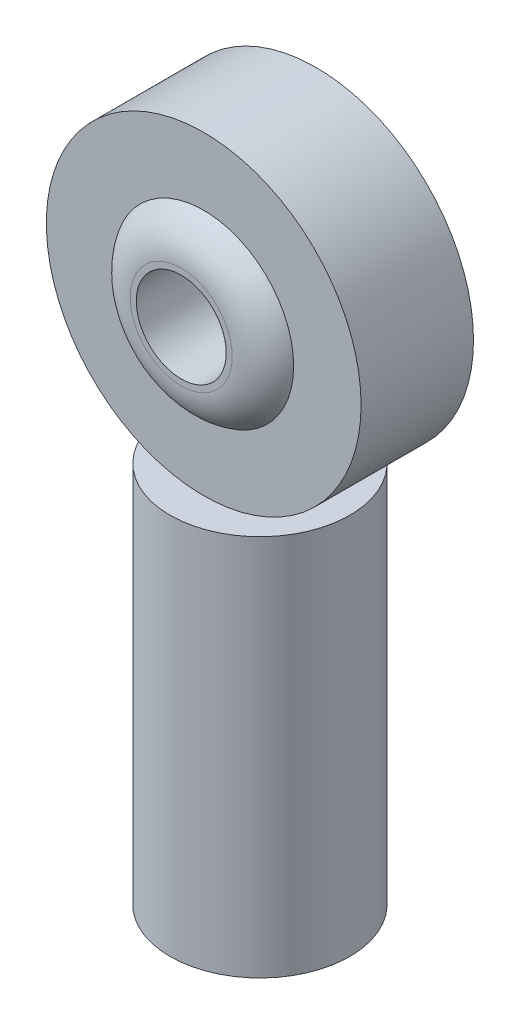
ISO-10303-21;
HEADER;
FILE_DESCRIPTION(('STEP AP214'),'2;1');
FILE_NAME('part.step','',(''),(''),'','','');
FILE_SCHEMA(('AUTOMOTIVE_DESIGN { 1 0 10303 214 1 1 1 1 }'));
ENDSEC;
DATA;
#1=APPLICATION_CONTEXT('core data for automotive mechanical design processes');
#2=APPLICATION_PROTOCOL_DEFINITION('international standard','automotive_design',2000,#1);
#3=PRODUCT_CONTEXT('',#1,'mechanical');
#4=PRODUCT('Part','Part','',(#3));
#5=PRODUCT_RELATED_PRODUCT_CATEGORY('part','',(#4));
#6=PRODUCT_DEFINITION_FORMATION('','',#4);
#7=PRODUCT_DEFINITION_CONTEXT('part definition',#1,'design');
#8=PRODUCT_DEFINITION('design','',#6,#7);
#9=PRODUCT_DEFINITION_SHAPE('','',#8);
#10=(LENGTH_UNIT() NAMED_UNIT(*) SI_UNIT(.MILLI.,.METRE.));
#11=(NAMED_UNIT(*) PLANE_ANGLE_UNIT() SI_UNIT($,.RADIAN.));
#12=(NAMED_UNIT(*) SI_UNIT($,.STERADIAN.) SOLID_ANGLE_UNIT());
#13=UNCERTAINTY_MEASURE_WITH_UNIT(LENGTH_MEASURE(1.E-05),#10,'distance_accuracy_value','');
#14=(GEOMETRIC_REPRESENTATION_CONTEXT(3) GLOBAL_UNCERTAINTY_ASSIGNED_CONTEXT((#13)) GLOBAL_UNIT_ASSIGNED_CONTEXT((#10,
#11,#12)) REPRESENTATION_CONTEXT('',''));
#15=CARTESIAN_POINT('',(0.,0.,0.));
#16=DIRECTION('',(0.,0.,1.));
#17=DIRECTION('',(1.,0.,0.));
#18=AXIS2_PLACEMENT_3D('',#15,#16,#17);
#19=CARTESIAN_POINT('',(0.,-24.,0.));
#20=DIRECTION('',(0.,1.,0.));
#21=DIRECTION('',(0.,0.,1.));
#22=AXIS2_PLACEMENT_3D('',#19,#20,#21);
#23=CYLINDRICAL_SURFACE('',#22,4.);
#24=CARTESIAN_POINT('',(0.,-24.,0.));
#25=DIRECTION('',(0.,1.,0.));
#26=DIRECTION('',(0.,0.,1.));
#27=AXIS2_PLACEMENT_3D('',#24,#25,#26);
#28=CIRCLE('',#27,4.);
#29=CARTESIAN_POINT('',(0.,-24.,4.));
#30=VERTEX_POINT('',#29);
#31=EDGE_CURVE('E11',#30,#30,#28,.T.);
#32=ORIENTED_EDGE('',*,*,#31,.T.);
#33=EDGE_LOOP('',(#32));
#34=FACE_BOUND('',#33,.T.);
#35=CARTESIAN_POINT('',(0.,-7.,0.));
#36=DIRECTION('',(0.,1.,0.));
#37=DIRECTION('',(0.,0.,1.));
#38=AXIS2_PLACEMENT_3D('',#35,#36,#37);
#39=CIRCLE('',#38,4.);
#40=CARTESIAN_POINT('',(0.,-7.,4.));
#41=VERTEX_POINT('',#40);
#42=EDGE_CURVE('E43',#41,#41,#39,.T.);
#43=ORIENTED_EDGE('',*,*,#42,.F.);
#44=EDGE_LOOP('',(#43));
#45=FACE_BOUND('',#44,.T.);
#46=ADVANCED_FACE('F40',(#34,#45),#23,.T.);
#47=CARTESIAN_POINT('',(0.,-24.,0.));
#48=DIRECTION('',(0.,1.,0.));
#49=DIRECTION('',(0.,0.,1.));
#50=AXIS2_PLACEMENT_3D('',#47,#48,#49);
#51=PLANE('',#50);
#52=CARTESIAN_POINT('',(0.,-24.,0.));
#53=DIRECTION('',(0.,-1.,0.));
#54=DIRECTION('',(0.,0.,-1.));
#55=AXIS2_PLACEMENT_3D('',#52,#53,#54);
#56=CIRCLE('',#55,2.);
#57=CARTESIAN_POINT('',(0.,-24.,-2.));
#58=VERTEX_POINT('',#57);
#59=EDGE_CURVE('E52',#58,#58,#56,.T.);
#60=ORIENTED_EDGE('',*,*,#59,.F.);
#61=EDGE_LOOP('',(#60));
#62=FACE_BOUND('',#61,.T.);
#63=ORIENTED_EDGE('',*,*,#31,.F.);
#64=EDGE_LOOP('',(#63));
#65=FACE_BOUND('',#64,.T.);
#66=ADVANCED_FACE('F67',(#62,#65),#51,.F.);
#67=CARTESIAN_POINT('',(0.,-7.,0.));
#68=DIRECTION('',(0.,1.,0.));
#69=DIRECTION('',(0.,0.,1.));
#70=AXIS2_PLACEMENT_3D('',#67,#68,#69);
#71=PLANE('',#70);
#72=ORIENTED_EDGE('',*,*,#42,.T.);
#73=EDGE_LOOP('',(#72));
#74=FACE_BOUND('',#73,.T.);
#75=ADVANCED_FACE('F63',(#74),#71,.T.);
#76=CARTESIAN_POINT('',(0.,-12.,0.));
#77=DIRECTION('',(0.,-1.,0.));
#78=DIRECTION('',(0.,0.,-1.));
#79=AXIS2_PLACEMENT_3D('',#76,#77,#78);
#80=CYLINDRICAL_SURFACE('',#79,2.);
#81=CARTESIAN_POINT('',(0.,-12.,0.));
#82=DIRECTION('',(0.,-1.,0.));
#83=DIRECTION('',(0.,0.,-1.));
#84=AXIS2_PLACEMENT_3D('',#81,#82,#83);
#85=CIRCLE('',#84,2.);
#86=CARTESIAN_POINT('',(0.,-12.,-2.));
#87=VERTEX_POINT('',#86);
#88=EDGE_CURVE('E50',#87,#87,#85,.T.);
#89=ORIENTED_EDGE('',*,*,#88,.F.);
#90=EDGE_LOOP('',(#89));
#91=FACE_BOUND('',#90,.T.);
#92=ORIENTED_EDGE('',*,*,#59,.T.);
#93=EDGE_LOOP('',(#92));
#94=FACE_BOUND('',#93,.T.);
#95=ADVANCED_FACE('F60',(#91,#94),#80,.F.);
#96=CARTESIAN_POINT('',(0.,-12.,0.));
#97=DIRECTION('',(0.,-1.,0.));
#98=DIRECTION('',(0.,0.,-1.));
#99=AXIS2_PLACEMENT_3D('',#96,#97,#98);
#100=PLANE('',#99);
#101=ORIENTED_EDGE('',*,*,#88,.T.);
#102=EDGE_LOOP('',(#101));
#103=FACE_BOUND('',#102,.T.);
#104=ADVANCED_FACE('F58',(#103),#100,.T.);
#105=CLOSED_SHELL('',(#46,#66,#75,#95,#104));
#106=MANIFOLD_SOLID_BREP('B2',#105);
#107=CARTESIAN_POINT('',(0.,0.,-2.5));
#108=DIRECTION('',(0.,0.,1.));
#109=DIRECTION('',(1.,0.,0.));
#110=AXIS2_PLACEMENT_3D('',#107,#108,#109);
#111=CYLINDRICAL_SURFACE('',#110,7.);
#112=CARTESIAN_POINT('',(0.,0.,-2.5));
#113=DIRECTION('',(0.,0.,1.));
#114=DIRECTION('',(1.,0.,0.));
#115=AXIS2_PLACEMENT_3D('',#112,#113,#114);
#116=CIRCLE('',#115,7.);
#117=CARTESIAN_POINT('',(7.,0.,-2.5));
#118=VERTEX_POINT('',#117);
#119=EDGE_CURVE('E125',#118,#118,#116,.T.);
#120=ORIENTED_EDGE('',*,*,#119,.T.);
#121=EDGE_LOOP('',(#120));
#122=FACE_BOUND('',#121,.T.);
#123=CARTESIAN_POINT('',(0.,0.,2.5));
#124=DIRECTION('',(0.,0.,1.));
#125=DIRECTION('',(1.,0.,0.));
#126=AXIS2_PLACEMENT_3D('',#123,#124,#125);
#127=CIRCLE('',#126,7.);
#128=CARTESIAN_POINT('',(7.,0.,2.5));
#129=VERTEX_POINT('',#128);
#130=EDGE_CURVE('E135',#129,#129,#127,.T.);
#131=ORIENTED_EDGE('',*,*,#130,.F.);
#132=EDGE_LOOP('',(#131));
#133=FACE_BOUND('',#132,.T.);
#134=ADVANCED_FACE('F110',(#122,#133),#111,.T.);
#135=CARTESIAN_POINT('',(0.,0.,-2.5));
#136=DIRECTION('',(0.,0.,1.));
#137=DIRECTION('',(1.,0.,0.));
#138=AXIS2_PLACEMENT_3D('',#135,#136,#137);
#139=PLANE('',#138);
#140=CARTESIAN_POINT('',(0.,0.,-2.5));
#141=DIRECTION('',(0.,0.,1.));
#142=DIRECTION('',(1.,0.,0.));
#143=AXIS2_PLACEMENT_3D('',#140,#141,#142);
#144=CIRCLE('',#143,4.);
#145=CARTESIAN_POINT('',(4.,0.,-2.5));
#146=VERTEX_POINT('',#145);
#147=EDGE_CURVE('E130',#146,#146,#144,.T.);
#148=ORIENTED_EDGE('',*,*,#147,.T.);
#149=EDGE_LOOP('',(#148));
#150=FACE_BOUND('',#149,.T.);
#151=ORIENTED_EDGE('',*,*,#119,.F.);
#152=EDGE_LOOP('',(#151));
#153=FACE_BOUND('',#152,.T.);
#154=ADVANCED_FACE('F156',(#150,#153),#139,.F.);
#155=CARTESIAN_POINT('',(0.,0.,2.5));
#156=DIRECTION('',(0.,0.,1.));
#157=DIRECTION('',(1.,0.,0.));
#158=AXIS2_PLACEMENT_3D('',#155,#156,#157);
#159=PLANE('',#158);
#160=CARTESIAN_POINT('',(0.,0.,2.5));
#161=DIRECTION('',(0.,0.,1.));
#162=DIRECTION('',(1.,0.,0.));
#163=AXIS2_PLACEMENT_3D('',#160,#161,#162);
#164=CIRCLE('',#163,4.);
#165=CARTESIAN_POINT('',(4.,0.,2.5));
#166=VERTEX_POINT('',#165);
#167=EDGE_CURVE('E121',#166,#166,#164,.T.);
#168=ORIENTED_EDGE('',*,*,#167,.F.);
#169=EDGE_LOOP('',(#168));
#170=FACE_BOUND('',#169,.T.);
#171=ORIENTED_EDGE('',*,*,#130,.T.);
#172=EDGE_LOOP('',(#171));
#173=FACE_BOUND('',#172,.T.);
#174=ADVANCED_FACE('F149',(#170,#173),#159,.T.);
#175=CARTESIAN_POINT('',(0.,0.,3.5));
#176=DIRECTION('',(0.,0.,1.));
#177=DIRECTION('',(1.,0.,0.));
#178=AXIS2_PLACEMENT_3D('',#175,#176,#177);
#179=PLANE('',#178);
#180=CARTESIAN_POINT('',(0.,0.,3.5));
#181=DIRECTION('',(0.,0.,1.));
#182=DIRECTION('',(1.,0.,0.));
#183=AXIS2_PLACEMENT_3D('',#180,#181,#182);
#184=CIRCLE('',#183,2.26794919243112);
#185=CARTESIAN_POINT('',(2.26794919243112,0.,3.5));
#186=VERTEX_POINT('',#185);
#187=EDGE_CURVE('E39',#186,#186,#184,.T.);
#188=ORIENTED_EDGE('',*,*,#187,.T.);
#189=EDGE_LOOP('',(#188));
#190=FACE_BOUND('',#189,.T.);
#191=CARTESIAN_POINT('',(0.,0.,3.5));
#192=DIRECTION('',(0.,0.,1.));
#193=DIRECTION('',(1.,0.,0.));
#194=AXIS2_PLACEMENT_3D('',#191,#192,#193);
#195=CIRCLE('',#194,2.);
#196=CARTESIAN_POINT('',(2.,0.,3.5));
#197=VERTEX_POINT('',#196);
#198=EDGE_CURVE('E131',#197,#197,#195,.T.);
#199=ORIENTED_EDGE('',*,*,#198,.F.);
#200=EDGE_LOOP('',(#199));
#201=FACE_BOUND('',#200,.T.);
#202=ADVANCED_FACE('F146',(#190,#201),#179,.T.);
#203=CARTESIAN_POINT('',(0.,0.,-3.5));
#204=DIRECTION('',(0.,0.,1.));
#205=DIRECTION('',(1.,0.,0.));
#206=AXIS2_PLACEMENT_3D('',#203,#204,#205);
#207=PLANE('',#206);
#208=CARTESIAN_POINT('',(0.,0.,-3.5));
#209=DIRECTION('',(0.,0.,1.));
#210=DIRECTION('',(1.,0.,0.));
#211=AXIS2_PLACEMENT_3D('',#208,#209,#210);
#212=CIRCLE('',#211,2.26794919243112);
#213=CARTESIAN_POINT('',(2.26794919243112,0.,-3.5));
#214=VERTEX_POINT('',#213);
#215=EDGE_CURVE('E117',#214,#214,#212,.F.);
#216=ORIENTED_EDGE('',*,*,#215,.T.);
#217=EDGE_LOOP('',(#216));
#218=FACE_BOUND('',#217,.T.);
#219=CARTESIAN_POINT('',(0.,0.,-3.5));
#220=DIRECTION('',(0.,0.,1.));
#221=DIRECTION('',(1.,0.,0.));
#222=AXIS2_PLACEMENT_3D('',#219,#220,#221);
#223=CIRCLE('',#222,2.);
#224=CARTESIAN_POINT('',(2.,0.,-3.5));
#225=VERTEX_POINT('',#224);
#226=EDGE_CURVE('E128',#225,#225,#223,.T.);
#227=ORIENTED_EDGE('',*,*,#226,.T.);
#228=EDGE_LOOP('',(#227));
#229=FACE_BOUND('',#228,.T.);
#230=ADVANCED_FACE('F148',(#218,#229),#207,.F.);
#231=CARTESIAN_POINT('',(0.,0.,-4.));
#232=DIRECTION('',(0.,0.,1.));
#233=DIRECTION('',(1.,0.,0.));
#234=AXIS2_PLACEMENT_3D('',#231,#232,#233);
#235=CYLINDRICAL_SURFACE('',#234,2.);
#236=ORIENTED_EDGE('',*,*,#198,.T.);
#237=EDGE_LOOP('',(#236));
#238=FACE_BOUND('',#237,.T.);
#239=ORIENTED_EDGE('',*,*,#226,.F.);
#240=EDGE_LOOP('',(#239));
#241=FACE_BOUND('',#240,.T.);
#242=ADVANCED_FACE('F143',(#238,#241),#235,.F.);
#243=CARTESIAN_POINT('',(0.,0.,-1.5));
#244=DIRECTION('',(0.,0.,-1.));
#245=DIRECTION('',(-1.,0.,0.));
#246=AXIS2_PLACEMENT_3D('',#243,#244,#245);
#247=TOROIDAL_SURFACE('',#246,2.26794919243112,2.);
#248=ORIENTED_EDGE('',*,*,#215,.F.);
#249=EDGE_LOOP('',(#248));
#250=FACE_BOUND('',#249,.T.);
#251=ORIENTED_EDGE('',*,*,#147,.F.);
#252=EDGE_LOOP('',(#251));
#253=FACE_BOUND('',#252,.T.);
#254=ADVANCED_FACE('F169',(#250,#253),#247,.T.);
#255=CARTESIAN_POINT('',(0.,0.,1.5));
#256=DIRECTION('',(0.,0.,-1.));
#257=DIRECTION('',(-1.,0.,0.));
#258=AXIS2_PLACEMENT_3D('',#255,#256,#257);
#259=TOROIDAL_SURFACE('',#258,2.26794919243112,2.);
#260=ORIENTED_EDGE('',*,*,#167,.T.);
#261=EDGE_LOOP('',(#260));
#262=FACE_BOUND('',#261,.T.);
#263=ORIENTED_EDGE('',*,*,#187,.F.);
#264=EDGE_LOOP('',(#263));
#265=FACE_BOUND('',#264,.T.);
#266=ADVANCED_FACE('F112',(#262,#265),#259,.T.);
#267=CLOSED_SHELL('',(#134,#154,#174,#202,#230,#242,#254,#266));
#268=MANIFOLD_SOLID_BREP('B6',#267);
#269=ADVANCED_BREP_SHAPE_REPRESENTATION('',(#18,#106,#268),#14);
#270=SHAPE_DEFINITION_REPRESENTATION(#9,#269);
ENDSEC;
END-ISO-10303-21;
